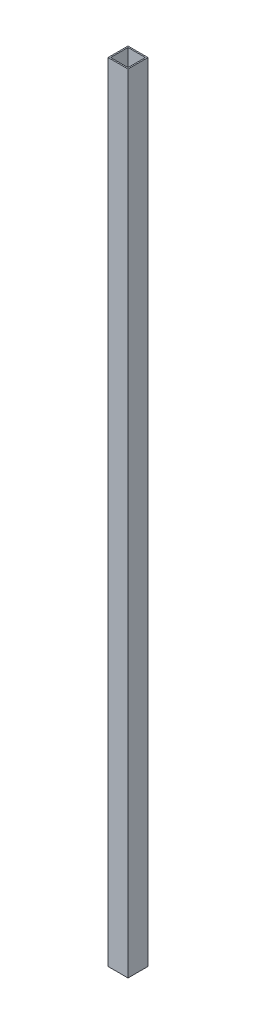
ISO-10303-21;
HEADER;
FILE_DESCRIPTION(('STEP AP214'),'2;1');
FILE_NAME('part.step','',(''),(''),'','','');
FILE_SCHEMA(('AUTOMOTIVE_DESIGN { 1 0 10303 214 1 1 1 1 }'));
ENDSEC;
DATA;
#1=APPLICATION_CONTEXT('core data for automotive mechanical design processes');
#2=APPLICATION_PROTOCOL_DEFINITION('international standard','automotive_design',2000,#1);
#3=PRODUCT_CONTEXT('',#1,'mechanical');
#4=PRODUCT('Part','Part','',(#3));
#5=PRODUCT_RELATED_PRODUCT_CATEGORY('part','',(#4));
#6=PRODUCT_DEFINITION_FORMATION('','',#4);
#7=PRODUCT_DEFINITION_CONTEXT('part definition',#1,'design');
#8=PRODUCT_DEFINITION('design','',#6,#7);
#9=PRODUCT_DEFINITION_SHAPE('','',#8);
#10=(LENGTH_UNIT() NAMED_UNIT(*) SI_UNIT(.MILLI.,.METRE.));
#11=(NAMED_UNIT(*) PLANE_ANGLE_UNIT() SI_UNIT($,.RADIAN.));
#12=(NAMED_UNIT(*) SI_UNIT($,.STERADIAN.) SOLID_ANGLE_UNIT());
#13=UNCERTAINTY_MEASURE_WITH_UNIT(LENGTH_MEASURE(1.E-05),#10,'distance_accuracy_value','');
#14=(GEOMETRIC_REPRESENTATION_CONTEXT(3) GLOBAL_UNCERTAINTY_ASSIGNED_CONTEXT((#13)) GLOBAL_UNIT_ASSIGNED_CONTEXT((#10,
#11,#12)) REPRESENTATION_CONTEXT('',''));
#15=CARTESIAN_POINT('',(0.,0.,0.));
#16=DIRECTION('',(0.,0.,1.));
#17=DIRECTION('',(1.,0.,0.));
#18=AXIS2_PLACEMENT_3D('',#15,#16,#17);
#19=CARTESIAN_POINT('',(0.,1003.3,0.));
#20=DIRECTION('',(0.,-1.,0.));
#21=DIRECTION('',(0.,0.,-1.));
#22=AXIS2_PLACEMENT_3D('',#19,#20,#21);
#23=PLANE('',#22);
#24=DIRECTION('',(0.,0.,-1.));
#25=VECTOR('',#24,1.);
#26=CARTESIAN_POINT('',(12.7,1003.3,12.7));
#27=LINE('',#26,#25);
#28=CARTESIAN_POINT('',(12.7,1003.3,12.7));
#29=VERTEX_POINT('',#28);
#30=CARTESIAN_POINT('',(12.7,1003.3,-12.7));
#31=VERTEX_POINT('',#30);
#32=EDGE_CURVE('E133',#29,#31,#27,.T.);
#33=ORIENTED_EDGE('',*,*,#32,.T.);
#34=DIRECTION('',(-1.,0.,0.));
#35=VECTOR('',#34,1.);
#36=CARTESIAN_POINT('',(-12.7,1003.3,-12.7));
#37=LINE('',#36,#35);
#38=CARTESIAN_POINT('',(-12.7,1003.3,-12.7));
#39=VERTEX_POINT('',#38);
#40=EDGE_CURVE('E136',#31,#39,#37,.T.);
#41=ORIENTED_EDGE('',*,*,#40,.T.);
#42=DIRECTION('',(0.,0.,1.));
#43=VECTOR('',#42,1.);
#44=CARTESIAN_POINT('',(-12.7,1003.3,12.7));
#45=LINE('',#44,#43);
#46=CARTESIAN_POINT('',(-12.7,1003.3,12.7));
#47=VERTEX_POINT('',#46);
#48=EDGE_CURVE('E139',#39,#47,#45,.T.);
#49=ORIENTED_EDGE('',*,*,#48,.T.);
#50=DIRECTION('',(1.,0.,0.));
#51=VECTOR('',#50,1.);
#52=CARTESIAN_POINT('',(-12.7,1003.3,12.7));
#53=LINE('',#52,#51);
#54=EDGE_CURVE('E141',#47,#29,#53,.T.);
#55=ORIENTED_EDGE('',*,*,#54,.T.);
#56=EDGE_LOOP('',(#33,#41,#49,#55));
#57=FACE_BOUND('',#56,.T.);
#58=DIRECTION('',(0.,0.,-1.));
#59=VECTOR('',#58,1.);
#60=CARTESIAN_POINT('',(11.1125,1003.3,11.1125));
#61=LINE('',#60,#59);
#62=CARTESIAN_POINT('',(11.1125,1003.3,11.1125));
#63=VERTEX_POINT('',#62);
#64=CARTESIAN_POINT('',(11.1125,1003.3,-11.1125));
#65=VERTEX_POINT('',#64);
#66=EDGE_CURVE('E97',#63,#65,#61,.T.);
#67=ORIENTED_EDGE('',*,*,#66,.F.);
#68=DIRECTION('',(1.,0.,0.));
#69=VECTOR('',#68,1.);
#70=CARTESIAN_POINT('',(-11.1125,1003.3,11.1125));
#71=LINE('',#70,#69);
#72=CARTESIAN_POINT('',(-11.1125,1003.3,11.1125));
#73=VERTEX_POINT('',#72);
#74=EDGE_CURVE('E119',#73,#63,#71,.T.);
#75=ORIENTED_EDGE('',*,*,#74,.F.);
#76=DIRECTION('',(0.,0.,1.));
#77=VECTOR('',#76,1.);
#78=CARTESIAN_POINT('',(-11.1125,1003.3,11.1125));
#79=LINE('',#78,#77);
#80=CARTESIAN_POINT('',(-11.1125,1003.3,-11.1125));
#81=VERTEX_POINT('',#80);
#82=EDGE_CURVE('E117',#81,#73,#79,.T.);
#83=ORIENTED_EDGE('',*,*,#82,.F.);
#84=DIRECTION('',(-1.,0.,0.));
#85=VECTOR('',#84,1.);
#86=CARTESIAN_POINT('',(-11.1125,1003.3,-11.1125));
#87=LINE('',#86,#85);
#88=EDGE_CURVE('E105',#65,#81,#87,.T.);
#89=ORIENTED_EDGE('',*,*,#88,.F.);
#90=EDGE_LOOP('',(#67,#75,#83,#89));
#91=FACE_BOUND('',#90,.T.);
#92=ADVANCED_FACE('F32',(#57,#91),#23,.F.);
#93=CARTESIAN_POINT('',(0.,0.,0.));
#94=DIRECTION('',(0.,-1.,0.));
#95=DIRECTION('',(0.,0.,-1.));
#96=AXIS2_PLACEMENT_3D('',#93,#94,#95);
#97=PLANE('',#96);
#98=DIRECTION('',(0.,0.,-1.));
#99=VECTOR('',#98,1.);
#100=CARTESIAN_POINT('',(12.7,0.,12.7));
#101=LINE('',#100,#99);
#102=CARTESIAN_POINT('',(12.7,0.,12.7));
#103=VERTEX_POINT('',#102);
#104=CARTESIAN_POINT('',(12.7,0.,-12.7));
#105=VERTEX_POINT('',#104);
#106=EDGE_CURVE('E113',#103,#105,#101,.T.);
#107=ORIENTED_EDGE('',*,*,#106,.F.);
#108=DIRECTION('',(1.,0.,0.));
#109=VECTOR('',#108,1.);
#110=CARTESIAN_POINT('',(-12.7,0.,12.7));
#111=LINE('',#110,#109);
#112=CARTESIAN_POINT('',(-12.7,0.,12.7));
#113=VERTEX_POINT('',#112);
#114=EDGE_CURVE('E137',#113,#103,#111,.T.);
#115=ORIENTED_EDGE('',*,*,#114,.F.);
#116=DIRECTION('',(0.,0.,1.));
#117=VECTOR('',#116,1.);
#118=CARTESIAN_POINT('',(-12.7,0.,12.7));
#119=LINE('',#118,#117);
#120=CARTESIAN_POINT('',(-12.7,0.,-12.7));
#121=VERTEX_POINT('',#120);
#122=EDGE_CURVE('E148',#121,#113,#119,.T.);
#123=ORIENTED_EDGE('',*,*,#122,.F.);
#124=DIRECTION('',(-1.,0.,0.));
#125=VECTOR('',#124,1.);
#126=CARTESIAN_POINT('',(-12.7,0.,-12.7));
#127=LINE('',#126,#125);
#128=EDGE_CURVE('E146',#105,#121,#127,.T.);
#129=ORIENTED_EDGE('',*,*,#128,.F.);
#130=EDGE_LOOP('',(#107,#115,#123,#129));
#131=FACE_BOUND('',#130,.T.);
#132=DIRECTION('',(1.,0.,0.));
#133=VECTOR('',#132,1.);
#134=CARTESIAN_POINT('',(-11.1125,0.,11.1125));
#135=LINE('',#134,#133);
#136=CARTESIAN_POINT('',(-11.1125,0.,11.1125));
#137=VERTEX_POINT('',#136);
#138=CARTESIAN_POINT('',(11.1125,0.,11.1125));
#139=VERTEX_POINT('',#138);
#140=EDGE_CURVE('E106',#137,#139,#135,.T.);
#141=ORIENTED_EDGE('',*,*,#140,.T.);
#142=DIRECTION('',(0.,0.,-1.));
#143=VECTOR('',#142,1.);
#144=CARTESIAN_POINT('',(11.1125,0.,11.1125));
#145=LINE('',#144,#143);
#146=CARTESIAN_POINT('',(11.1125,0.,-11.1125));
#147=VERTEX_POINT('',#146);
#148=EDGE_CURVE('E55',#139,#147,#145,.T.);
#149=ORIENTED_EDGE('',*,*,#148,.T.);
#150=DIRECTION('',(-1.,0.,0.));
#151=VECTOR('',#150,1.);
#152=CARTESIAN_POINT('',(-11.1125,0.,-11.1125));
#153=LINE('',#152,#151);
#154=CARTESIAN_POINT('',(-11.1125,0.,-11.1125));
#155=VERTEX_POINT('',#154);
#156=EDGE_CURVE('E112',#147,#155,#153,.T.);
#157=ORIENTED_EDGE('',*,*,#156,.T.);
#158=DIRECTION('',(0.,0.,1.));
#159=VECTOR('',#158,1.);
#160=CARTESIAN_POINT('',(-11.1125,0.,11.1125));
#161=LINE('',#160,#159);
#162=EDGE_CURVE('E125',#155,#137,#161,.T.);
#163=ORIENTED_EDGE('',*,*,#162,.T.);
#164=EDGE_LOOP('',(#141,#149,#157,#163));
#165=FACE_BOUND('',#164,.T.);
#166=ADVANCED_FACE('F166',(#131,#165),#97,.T.);
#167=CARTESIAN_POINT('',(12.7,1003.3,12.7));
#168=DIRECTION('',(-1.,0.,0.));
#169=DIRECTION('',(0.,0.,1.));
#170=AXIS2_PLACEMENT_3D('',#167,#168,#169);
#171=PLANE('',#170);
#172=ORIENTED_EDGE('',*,*,#106,.T.);
#173=DIRECTION('',(0.,-1.,0.));
#174=VECTOR('',#173,1.);
#175=CARTESIAN_POINT('',(12.7,1003.3,-12.7));
#176=LINE('',#175,#174);
#177=EDGE_CURVE('E11',#31,#105,#176,.T.);
#178=ORIENTED_EDGE('',*,*,#177,.F.);
#179=ORIENTED_EDGE('',*,*,#32,.F.);
#180=DIRECTION('',(0.,-1.,0.));
#181=VECTOR('',#180,1.);
#182=CARTESIAN_POINT('',(12.7,1003.3,12.7));
#183=LINE('',#182,#181);
#184=EDGE_CURVE('E143',#29,#103,#183,.T.);
#185=ORIENTED_EDGE('',*,*,#184,.T.);
#186=EDGE_LOOP('',(#172,#178,#179,#185));
#187=FACE_BOUND('',#186,.T.);
#188=ADVANCED_FACE('F34',(#187),#171,.F.);
#189=CARTESIAN_POINT('',(-12.7,1003.3,-12.7));
#190=DIRECTION('',(0.,0.,1.));
#191=DIRECTION('',(1.,0.,0.));
#192=AXIS2_PLACEMENT_3D('',#189,#190,#191);
#193=PLANE('',#192);
#194=ORIENTED_EDGE('',*,*,#128,.T.);
#195=DIRECTION('',(0.,-1.,0.));
#196=VECTOR('',#195,1.);
#197=CARTESIAN_POINT('',(-12.7,1003.3,-12.7));
#198=LINE('',#197,#196);
#199=EDGE_CURVE('E40',#39,#121,#198,.T.);
#200=ORIENTED_EDGE('',*,*,#199,.F.);
#201=ORIENTED_EDGE('',*,*,#40,.F.);
#202=ORIENTED_EDGE('',*,*,#177,.T.);
#203=EDGE_LOOP('',(#194,#200,#201,#202));
#204=FACE_BOUND('',#203,.T.);
#205=ADVANCED_FACE('F176',(#204),#193,.F.);
#206=CARTESIAN_POINT('',(-12.7,1003.3,12.7));
#207=DIRECTION('',(1.,0.,0.));
#208=DIRECTION('',(0.,0.,-1.));
#209=AXIS2_PLACEMENT_3D('',#206,#207,#208);
#210=PLANE('',#209);
#211=ORIENTED_EDGE('',*,*,#122,.T.);
#212=DIRECTION('',(0.,-1.,0.));
#213=VECTOR('',#212,1.);
#214=CARTESIAN_POINT('',(-12.7,1003.3,12.7));
#215=LINE('',#214,#213);
#216=EDGE_CURVE('E153',#47,#113,#215,.T.);
#217=ORIENTED_EDGE('',*,*,#216,.F.);
#218=ORIENTED_EDGE('',*,*,#48,.F.);
#219=ORIENTED_EDGE('',*,*,#199,.T.);
#220=EDGE_LOOP('',(#211,#217,#218,#219));
#221=FACE_BOUND('',#220,.T.);
#222=ADVANCED_FACE('F160',(#221),#210,.F.);
#223=CARTESIAN_POINT('',(-12.7,1003.3,12.7));
#224=DIRECTION('',(0.,0.,-1.));
#225=DIRECTION('',(-1.,0.,0.));
#226=AXIS2_PLACEMENT_3D('',#223,#224,#225);
#227=PLANE('',#226);
#228=ORIENTED_EDGE('',*,*,#114,.T.);
#229=ORIENTED_EDGE('',*,*,#184,.F.);
#230=ORIENTED_EDGE('',*,*,#54,.F.);
#231=ORIENTED_EDGE('',*,*,#216,.T.);
#232=EDGE_LOOP('',(#228,#229,#230,#231));
#233=FACE_BOUND('',#232,.T.);
#234=ADVANCED_FACE('F170',(#233),#227,.F.);
#235=CARTESIAN_POINT('',(11.1125,1003.3,11.1125));
#236=DIRECTION('',(-1.,0.,0.));
#237=DIRECTION('',(0.,0.,1.));
#238=AXIS2_PLACEMENT_3D('',#235,#236,#237);
#239=PLANE('',#238);
#240=ORIENTED_EDGE('',*,*,#148,.F.);
#241=DIRECTION('',(0.,-1.,0.));
#242=VECTOR('',#241,1.);
#243=CARTESIAN_POINT('',(11.1125,1003.3,11.1125));
#244=LINE('',#243,#242);
#245=EDGE_CURVE('E101',#63,#139,#244,.T.);
#246=ORIENTED_EDGE('',*,*,#245,.F.);
#247=ORIENTED_EDGE('',*,*,#66,.T.);
#248=DIRECTION('',(0.,-1.,0.));
#249=VECTOR('',#248,1.);
#250=CARTESIAN_POINT('',(11.1125,1003.3,-11.1125));
#251=LINE('',#250,#249);
#252=EDGE_CURVE('E100',#65,#147,#251,.T.);
#253=ORIENTED_EDGE('',*,*,#252,.T.);
#254=EDGE_LOOP('',(#240,#246,#247,#253));
#255=FACE_BOUND('',#254,.T.);
#256=ADVANCED_FACE('F99',(#255),#239,.T.);
#257=CARTESIAN_POINT('',(-11.1125,1003.3,-11.1125));
#258=DIRECTION('',(0.,0.,1.));
#259=DIRECTION('',(1.,0.,0.));
#260=AXIS2_PLACEMENT_3D('',#257,#258,#259);
#261=PLANE('',#260);
#262=ORIENTED_EDGE('',*,*,#156,.F.);
#263=ORIENTED_EDGE('',*,*,#252,.F.);
#264=ORIENTED_EDGE('',*,*,#88,.T.);
#265=DIRECTION('',(0.,-1.,0.));
#266=VECTOR('',#265,1.);
#267=CARTESIAN_POINT('',(-11.1125,1003.3,-11.1125));
#268=LINE('',#267,#266);
#269=EDGE_CURVE('E114',#81,#155,#268,.T.);
#270=ORIENTED_EDGE('',*,*,#269,.T.);
#271=EDGE_LOOP('',(#262,#263,#264,#270));
#272=FACE_BOUND('',#271,.T.);
#273=ADVANCED_FACE('F109',(#272),#261,.T.);
#274=CARTESIAN_POINT('',(-11.1125,1003.3,11.1125));
#275=DIRECTION('',(1.,0.,0.));
#276=DIRECTION('',(0.,0.,-1.));
#277=AXIS2_PLACEMENT_3D('',#274,#275,#276);
#278=PLANE('',#277);
#279=ORIENTED_EDGE('',*,*,#162,.F.);
#280=ORIENTED_EDGE('',*,*,#269,.F.);
#281=ORIENTED_EDGE('',*,*,#82,.T.);
#282=DIRECTION('',(0.,-1.,0.));
#283=VECTOR('',#282,1.);
#284=CARTESIAN_POINT('',(-11.1125,1003.3,11.1125));
#285=LINE('',#284,#283);
#286=EDGE_CURVE('E47',#73,#137,#285,.T.);
#287=ORIENTED_EDGE('',*,*,#286,.T.);
#288=EDGE_LOOP('',(#279,#280,#281,#287));
#289=FACE_BOUND('',#288,.T.);
#290=ADVANCED_FACE('F199',(#289),#278,.T.);
#291=CARTESIAN_POINT('',(-11.1125,1003.3,11.1125));
#292=DIRECTION('',(0.,0.,-1.));
#293=DIRECTION('',(-1.,0.,0.));
#294=AXIS2_PLACEMENT_3D('',#291,#292,#293);
#295=PLANE('',#294);
#296=ORIENTED_EDGE('',*,*,#140,.F.);
#297=ORIENTED_EDGE('',*,*,#286,.F.);
#298=ORIENTED_EDGE('',*,*,#74,.T.);
#299=ORIENTED_EDGE('',*,*,#245,.T.);
#300=EDGE_LOOP('',(#296,#297,#298,#299));
#301=FACE_BOUND('',#300,.T.);
#302=ADVANCED_FACE('F203',(#301),#295,.T.);
#303=CLOSED_SHELL('',(#92,#166,#188,#205,#222,#234,#256,#273,#290,#302));
#304=MANIFOLD_SOLID_BREP('B2',#303);
#305=ADVANCED_BREP_SHAPE_REPRESENTATION('',(#18,#304),#14);
#306=SHAPE_DEFINITION_REPRESENTATION(#9,#305);
ENDSEC;
END-ISO-10303-21;
